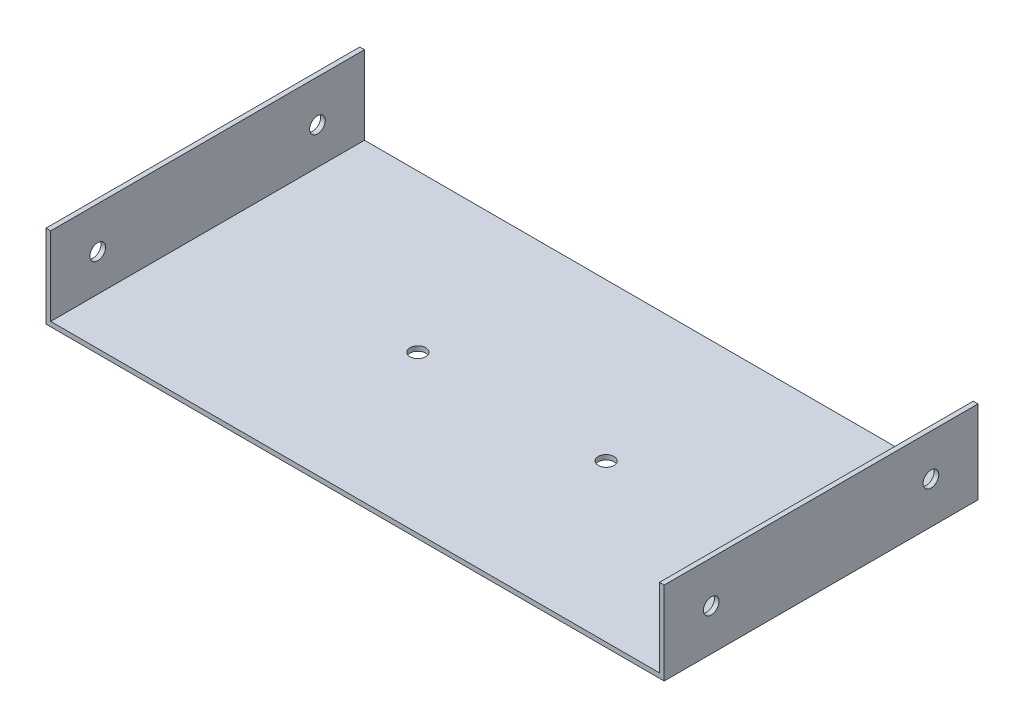
ISO-10303-21;
HEADER;
FILE_DESCRIPTION(('STEP AP214'),'2;1');
FILE_NAME('part.step','',(''),(''),'','','');
FILE_SCHEMA(('AUTOMOTIVE_DESIGN { 1 0 10303 214 1 1 1 1 }'));
ENDSEC;
DATA;
#1=APPLICATION_CONTEXT('core data for automotive mechanical design processes');
#2=APPLICATION_PROTOCOL_DEFINITION('international standard','automotive_design',2000,#1);
#3=PRODUCT_CONTEXT('',#1,'mechanical');
#4=PRODUCT('Part','Part','',(#3));
#5=PRODUCT_RELATED_PRODUCT_CATEGORY('part','',(#4));
#6=PRODUCT_DEFINITION_FORMATION('','',#4);
#7=PRODUCT_DEFINITION_CONTEXT('part definition',#1,'design');
#8=PRODUCT_DEFINITION('design','',#6,#7);
#9=PRODUCT_DEFINITION_SHAPE('','',#8);
#10=(LENGTH_UNIT() NAMED_UNIT(*) SI_UNIT(.MILLI.,.METRE.));
#11=(NAMED_UNIT(*) PLANE_ANGLE_UNIT() SI_UNIT($,.RADIAN.));
#12=(NAMED_UNIT(*) SI_UNIT($,.STERADIAN.) SOLID_ANGLE_UNIT());
#13=UNCERTAINTY_MEASURE_WITH_UNIT(LENGTH_MEASURE(1.E-05),#10,'distance_accuracy_value','');
#14=(GEOMETRIC_REPRESENTATION_CONTEXT(3) GLOBAL_UNCERTAINTY_ASSIGNED_CONTEXT((#13)) GLOBAL_UNIT_ASSIGNED_CONTEXT((#10,
#11,#12)) REPRESENTATION_CONTEXT('',''));
#15=CARTESIAN_POINT('',(0.,0.,0.));
#16=DIRECTION('',(0.,0.,1.));
#17=DIRECTION('',(1.,0.,0.));
#18=AXIS2_PLACEMENT_3D('',#15,#16,#17);
#19=CARTESIAN_POINT('',(197.,3.,-100.));
#20=DIRECTION('',(-1.,0.,0.));
#21=DIRECTION('',(0.,0.,1.));
#22=AXIS2_PLACEMENT_3D('',#19,#20,#21);
#23=PLANE('',#22);
#24=CARTESIAN_POINT('',(197.,26.5,-70.));
#25=DIRECTION('',(1.,0.,0.));
#26=DIRECTION('',(0.,0.,-1.));
#27=AXIS2_PLACEMENT_3D('',#24,#25,#26);
#28=CIRCLE('',#27,5.);
#29=CARTESIAN_POINT('',(197.,26.5,-75.));
#30=VERTEX_POINT('',#29);
#31=EDGE_CURVE('E173',#30,#30,#28,.T.);
#32=ORIENTED_EDGE('',*,*,#31,.F.);
#33=EDGE_LOOP('',(#32));
#34=FACE_BOUND('',#33,.T.);
#35=CARTESIAN_POINT('',(197.,26.5,70.));
#36=DIRECTION('',(1.,0.,0.));
#37=DIRECTION('',(0.,0.,-1.));
#38=AXIS2_PLACEMENT_3D('',#35,#36,#37);
#39=CIRCLE('',#38,4.99999999999999);
#40=CARTESIAN_POINT('',(197.,26.5,65.));
#41=VERTEX_POINT('',#40);
#42=EDGE_CURVE('E186',#41,#41,#39,.T.);
#43=ORIENTED_EDGE('',*,*,#42,.F.);
#44=EDGE_LOOP('',(#43));
#45=FACE_BOUND('',#44,.T.);
#46=DIRECTION('',(0.,0.,-1.));
#47=VECTOR('',#46,1.);
#48=CARTESIAN_POINT('',(197.,0.,-100.));
#49=LINE('',#48,#47);
#50=CARTESIAN_POINT('',(197.,0.,100.));
#51=VERTEX_POINT('',#50);
#52=CARTESIAN_POINT('',(197.,0.,-100.));
#53=VERTEX_POINT('',#52);
#54=EDGE_CURVE('E147',#51,#53,#49,.T.);
#55=ORIENTED_EDGE('',*,*,#54,.T.);
#56=DIRECTION('',(0.,-1.,0.));
#57=VECTOR('',#56,1.);
#58=CARTESIAN_POINT('',(197.,3.,-100.));
#59=LINE('',#58,#57);
#60=CARTESIAN_POINT('',(197.,53.,-100.));
#61=VERTEX_POINT('',#60);
#62=EDGE_CURVE('E11',#61,#53,#59,.T.);
#63=ORIENTED_EDGE('',*,*,#62,.F.);
#64=DIRECTION('',(0.,0.,-1.));
#65=VECTOR('',#64,1.);
#66=CARTESIAN_POINT('',(197.,53.,100.));
#67=LINE('',#66,#65);
#68=CARTESIAN_POINT('',(197.,53.,100.));
#69=VERTEX_POINT('',#68);
#70=EDGE_CURVE('E132',#69,#61,#67,.T.);
#71=ORIENTED_EDGE('',*,*,#70,.F.);
#72=DIRECTION('',(0.,-1.,0.));
#73=VECTOR('',#72,1.);
#74=CARTESIAN_POINT('',(197.,3.,100.));
#75=LINE('',#74,#73);
#76=EDGE_CURVE('E151',#69,#51,#75,.T.);
#77=ORIENTED_EDGE('',*,*,#76,.T.);
#78=EDGE_LOOP('',(#55,#63,#71,#77));
#79=FACE_BOUND('',#78,.T.);
#80=ADVANCED_FACE('F34',(#34,#45,#79),#23,.F.);
#81=CARTESIAN_POINT('',(-197.,3.,-100.));
#82=DIRECTION('',(0.,0.,1.));
#83=DIRECTION('',(1.,0.,0.));
#84=AXIS2_PLACEMENT_3D('',#81,#82,#83);
#85=PLANE('',#84);
#86=DIRECTION('',(-1.,0.,0.));
#87=VECTOR('',#86,1.);
#88=CARTESIAN_POINT('',(-197.,0.,-100.));
#89=LINE('',#88,#87);
#90=CARTESIAN_POINT('',(-197.,0.,-100.));
#91=VERTEX_POINT('',#90);
#92=EDGE_CURVE('E154',#53,#91,#89,.T.);
#93=ORIENTED_EDGE('',*,*,#92,.T.);
#94=DIRECTION('',(0.,-1.,0.));
#95=VECTOR('',#94,1.);
#96=CARTESIAN_POINT('',(-197.,3.,-100.));
#97=LINE('',#96,#95);
#98=CARTESIAN_POINT('',(-197.,53.,-100.));
#99=VERTEX_POINT('',#98);
#100=EDGE_CURVE('E42',#99,#91,#97,.T.);
#101=ORIENTED_EDGE('',*,*,#100,.F.);
#102=DIRECTION('',(1.,0.,0.));
#103=VECTOR('',#102,1.);
#104=CARTESIAN_POINT('',(-197.,53.,-100.));
#105=LINE('',#104,#103);
#106=CARTESIAN_POINT('',(-194.,53.,-100.));
#107=VERTEX_POINT('',#106);
#108=EDGE_CURVE('E122',#99,#107,#105,.T.);
#109=ORIENTED_EDGE('',*,*,#108,.T.);
#110=DIRECTION('',(0.,-1.,0.));
#111=VECTOR('',#110,1.);
#112=CARTESIAN_POINT('',(-194.,53.,-100.));
#113=LINE('',#112,#111);
#114=CARTESIAN_POINT('',(-194.,3.,-100.));
#115=VERTEX_POINT('',#114);
#116=EDGE_CURVE('E108',#107,#115,#113,.T.);
#117=ORIENTED_EDGE('',*,*,#116,.T.);
#118=DIRECTION('',(-1.,0.,0.));
#119=VECTOR('',#118,1.);
#120=CARTESIAN_POINT('',(-197.,3.,-100.));
#121=LINE('',#120,#119);
#122=CARTESIAN_POINT('',(194.,3.,-100.));
#123=VERTEX_POINT('',#122);
#124=EDGE_CURVE('E55',#123,#115,#121,.T.);
#125=ORIENTED_EDGE('',*,*,#124,.F.);
#126=DIRECTION('',(0.,-1.,0.));
#127=VECTOR('',#126,1.);
#128=CARTESIAN_POINT('',(194.,53.,-100.));
#129=LINE('',#128,#127);
#130=CARTESIAN_POINT('',(194.,53.,-100.));
#131=VERTEX_POINT('',#130);
#132=EDGE_CURVE('E144',#131,#123,#129,.T.);
#133=ORIENTED_EDGE('',*,*,#132,.F.);
#134=DIRECTION('',(-1.,0.,0.));
#135=VECTOR('',#134,1.);
#136=CARTESIAN_POINT('',(197.,53.,-100.));
#137=LINE('',#136,#135);
#138=EDGE_CURVE('E136',#61,#131,#137,.T.);
#139=ORIENTED_EDGE('',*,*,#138,.F.);
#140=ORIENTED_EDGE('',*,*,#62,.T.);
#141=EDGE_LOOP('',(#93,#101,#109,#117,#125,#133,#139,#140));
#142=FACE_BOUND('',#141,.T.);
#143=ADVANCED_FACE('F213',(#142),#85,.F.);
#144=CARTESIAN_POINT('',(-197.,3.,-100.));
#145=DIRECTION('',(1.,0.,0.));
#146=DIRECTION('',(0.,0.,-1.));
#147=AXIS2_PLACEMENT_3D('',#144,#145,#146);
#148=PLANE('',#147);
#149=CARTESIAN_POINT('',(-197.,26.5,-69.9999999999999));
#150=DIRECTION('',(1.,0.,0.));
#151=DIRECTION('',(0.,0.,-1.));
#152=AXIS2_PLACEMENT_3D('',#149,#150,#151);
#153=CIRCLE('',#152,5.);
#154=CARTESIAN_POINT('',(-197.,26.5,-74.9999999999999));
#155=VERTEX_POINT('',#154);
#156=EDGE_CURVE('E167',#155,#155,#153,.T.);
#157=ORIENTED_EDGE('',*,*,#156,.T.);
#158=EDGE_LOOP('',(#157));
#159=FACE_BOUND('',#158,.T.);
#160=CARTESIAN_POINT('',(-197.,26.5,70.0000000000001));
#161=DIRECTION('',(1.,0.,0.));
#162=DIRECTION('',(0.,0.,-1.));
#163=AXIS2_PLACEMENT_3D('',#160,#161,#162);
#164=CIRCLE('',#163,4.99999999999999);
#165=CARTESIAN_POINT('',(-197.,26.5,65.0000000000001));
#166=VERTEX_POINT('',#165);
#167=EDGE_CURVE('E178',#166,#166,#164,.T.);
#168=ORIENTED_EDGE('',*,*,#167,.T.);
#169=EDGE_LOOP('',(#168));
#170=FACE_BOUND('',#169,.T.);
#171=DIRECTION('',(0.,0.,1.));
#172=VECTOR('',#171,1.);
#173=CARTESIAN_POINT('',(-197.,0.,-100.));
#174=LINE('',#173,#172);
#175=CARTESIAN_POINT('',(-197.,0.,100.));
#176=VERTEX_POINT('',#175);
#177=EDGE_CURVE('E156',#91,#176,#174,.T.);
#178=ORIENTED_EDGE('',*,*,#177,.T.);
#179=DIRECTION('',(0.,-1.,0.));
#180=VECTOR('',#179,1.);
#181=CARTESIAN_POINT('',(-197.,3.,100.));
#182=LINE('',#181,#180);
#183=CARTESIAN_POINT('',(-197.,53.,100.));
#184=VERTEX_POINT('',#183);
#185=EDGE_CURVE('E161',#184,#176,#182,.T.);
#186=ORIENTED_EDGE('',*,*,#185,.F.);
#187=DIRECTION('',(0.,0.,-1.));
#188=VECTOR('',#187,1.);
#189=CARTESIAN_POINT('',(-197.,53.,100.));
#190=LINE('',#189,#188);
#191=EDGE_CURVE('E118',#184,#99,#190,.T.);
#192=ORIENTED_EDGE('',*,*,#191,.T.);
#193=ORIENTED_EDGE('',*,*,#100,.T.);
#194=EDGE_LOOP('',(#178,#186,#192,#193));
#195=FACE_BOUND('',#194,.T.);
#196=ADVANCED_FACE('F218',(#159,#170,#195),#148,.F.);
#197=CARTESIAN_POINT('',(-197.,3.,100.));
#198=DIRECTION('',(0.,0.,-1.));
#199=DIRECTION('',(-1.,0.,0.));
#200=AXIS2_PLACEMENT_3D('',#197,#198,#199);
#201=PLANE('',#200);
#202=DIRECTION('',(1.,0.,0.));
#203=VECTOR('',#202,1.);
#204=CARTESIAN_POINT('',(-197.,0.,100.));
#205=LINE('',#204,#203);
#206=EDGE_CURVE('E149',#176,#51,#205,.T.);
#207=ORIENTED_EDGE('',*,*,#206,.T.);
#208=ORIENTED_EDGE('',*,*,#76,.F.);
#209=DIRECTION('',(1.,0.,0.));
#210=VECTOR('',#209,1.);
#211=CARTESIAN_POINT('',(194.,53.,100.));
#212=LINE('',#211,#210);
#213=CARTESIAN_POINT('',(194.,53.,100.));
#214=VERTEX_POINT('',#213);
#215=EDGE_CURVE('E129',#214,#69,#212,.T.);
#216=ORIENTED_EDGE('',*,*,#215,.F.);
#217=DIRECTION('',(0.,-1.,0.));
#218=VECTOR('',#217,1.);
#219=CARTESIAN_POINT('',(194.,53.,100.));
#220=LINE('',#219,#218);
#221=CARTESIAN_POINT('',(194.,3.,100.));
#222=VERTEX_POINT('',#221);
#223=EDGE_CURVE('E140',#214,#222,#220,.T.);
#224=ORIENTED_EDGE('',*,*,#223,.T.);
#225=DIRECTION('',(1.,0.,0.));
#226=VECTOR('',#225,1.);
#227=CARTESIAN_POINT('',(-197.,3.,100.));
#228=LINE('',#227,#226);
#229=CARTESIAN_POINT('',(-194.,3.,100.));
#230=VERTEX_POINT('',#229);
#231=EDGE_CURVE('E105',#230,#222,#228,.T.);
#232=ORIENTED_EDGE('',*,*,#231,.F.);
#233=DIRECTION('',(0.,-1.,0.));
#234=VECTOR('',#233,1.);
#235=CARTESIAN_POINT('',(-194.,53.,100.));
#236=LINE('',#235,#234);
#237=CARTESIAN_POINT('',(-194.,53.,100.));
#238=VERTEX_POINT('',#237);
#239=EDGE_CURVE('E99',#238,#230,#236,.T.);
#240=ORIENTED_EDGE('',*,*,#239,.F.);
#241=DIRECTION('',(-1.,0.,0.));
#242=VECTOR('',#241,1.);
#243=CARTESIAN_POINT('',(-194.,53.,100.));
#244=LINE('',#243,#242);
#245=EDGE_CURVE('E103',#238,#184,#244,.T.);
#246=ORIENTED_EDGE('',*,*,#245,.T.);
#247=ORIENTED_EDGE('',*,*,#185,.T.);
#248=EDGE_LOOP('',(#207,#208,#216,#224,#232,#240,#246,#247));
#249=FACE_BOUND('',#248,.T.);
#250=ADVANCED_FACE('F101',(#249),#201,.F.);
#251=CARTESIAN_POINT('',(0.,3.,0.));
#252=DIRECTION('',(0.,1.,0.));
#253=DIRECTION('',(0.,0.,1.));
#254=AXIS2_PLACEMENT_3D('',#251,#252,#253);
#255=PLANE('',#254);
#256=CARTESIAN_POINT('',(60.,3.,0.));
#257=DIRECTION('',(0.,1.,0.));
#258=DIRECTION('',(0.,0.,1.));
#259=AXIS2_PLACEMENT_3D('',#256,#257,#258);
#260=CIRCLE('',#259,5.);
#261=CARTESIAN_POINT('',(60.,3.,5.));
#262=VERTEX_POINT('',#261);
#263=EDGE_CURVE('E181',#262,#262,#260,.T.);
#264=ORIENTED_EDGE('',*,*,#263,.F.);
#265=EDGE_LOOP('',(#264));
#266=FACE_BOUND('',#265,.T.);
#267=CARTESIAN_POINT('',(-60.,3.,0.));
#268=DIRECTION('',(0.,1.,0.));
#269=DIRECTION('',(0.,0.,1.));
#270=AXIS2_PLACEMENT_3D('',#267,#268,#269);
#271=CIRCLE('',#270,5.);
#272=CARTESIAN_POINT('',(-60.,3.,5.));
#273=VERTEX_POINT('',#272);
#274=EDGE_CURVE('E361',#273,#273,#271,.T.);
#275=ORIENTED_EDGE('',*,*,#274,.F.);
#276=EDGE_LOOP('',(#275));
#277=FACE_BOUND('',#276,.T.);
#278=DIRECTION('',(0.,0.,1.));
#279=VECTOR('',#278,1.);
#280=CARTESIAN_POINT('',(-194.,3.,-100.));
#281=LINE('',#280,#279);
#282=EDGE_CURVE('E50',#115,#230,#281,.T.);
#283=ORIENTED_EDGE('',*,*,#282,.T.);
#284=ORIENTED_EDGE('',*,*,#231,.T.);
#285=DIRECTION('',(0.,0.,1.));
#286=VECTOR('',#285,1.);
#287=CARTESIAN_POINT('',(194.,3.,-100.));
#288=LINE('',#287,#286);
#289=EDGE_CURVE('E133',#123,#222,#288,.T.);
#290=ORIENTED_EDGE('',*,*,#289,.F.);
#291=ORIENTED_EDGE('',*,*,#124,.T.);
#292=EDGE_LOOP('',(#283,#284,#290,#291));
#293=FACE_BOUND('',#292,.T.);
#294=ADVANCED_FACE('F237',(#266,#277,#293),#255,.T.);
#295=CARTESIAN_POINT('',(0.,0.,0.));
#296=DIRECTION('',(0.,1.,0.));
#297=DIRECTION('',(0.,0.,1.));
#298=AXIS2_PLACEMENT_3D('',#295,#296,#297);
#299=PLANE('',#298);
#300=CARTESIAN_POINT('',(60.,0.,0.));
#301=DIRECTION('',(0.,-1.,0.));
#302=DIRECTION('',(0.,0.,-1.));
#303=AXIS2_PLACEMENT_3D('',#300,#301,#302);
#304=CIRCLE('',#303,5.);
#305=CARTESIAN_POINT('',(60.,0.,-5.));
#306=VERTEX_POINT('',#305);
#307=EDGE_CURVE('E360',#306,#306,#304,.T.);
#308=ORIENTED_EDGE('',*,*,#307,.F.);
#309=EDGE_LOOP('',(#308));
#310=FACE_BOUND('',#309,.T.);
#311=CARTESIAN_POINT('',(-60.,0.,0.));
#312=DIRECTION('',(0.,-1.,0.));
#313=DIRECTION('',(0.,0.,-1.));
#314=AXIS2_PLACEMENT_3D('',#311,#312,#313);
#315=CIRCLE('',#314,5.);
#316=CARTESIAN_POINT('',(-60.,0.,-5.));
#317=VERTEX_POINT('',#316);
#318=EDGE_CURVE('E362',#317,#317,#315,.T.);
#319=ORIENTED_EDGE('',*,*,#318,.F.);
#320=EDGE_LOOP('',(#319));
#321=FACE_BOUND('',#320,.T.);
#322=ORIENTED_EDGE('',*,*,#54,.F.);
#323=ORIENTED_EDGE('',*,*,#206,.F.);
#324=ORIENTED_EDGE('',*,*,#177,.F.);
#325=ORIENTED_EDGE('',*,*,#92,.F.);
#326=EDGE_LOOP('',(#322,#323,#324,#325));
#327=FACE_BOUND('',#326,.T.);
#328=ADVANCED_FACE('F228',(#310,#321,#327),#299,.F.);
#329=CARTESIAN_POINT('',(194.,53.,-100.));
#330=DIRECTION('',(1.,0.,0.));
#331=DIRECTION('',(0.,0.,-1.));
#332=AXIS2_PLACEMENT_3D('',#329,#330,#331);
#333=PLANE('',#332);
#334=CARTESIAN_POINT('',(194.,26.5,-70.));
#335=DIRECTION('',(1.,0.,0.));
#336=DIRECTION('',(0.,0.,-1.));
#337=AXIS2_PLACEMENT_3D('',#334,#335,#336);
#338=CIRCLE('',#337,5.);
#339=CARTESIAN_POINT('',(194.,26.5,-75.));
#340=VERTEX_POINT('',#339);
#341=EDGE_CURVE('E109',#340,#340,#338,.T.);
#342=ORIENTED_EDGE('',*,*,#341,.T.);
#343=EDGE_LOOP('',(#342));
#344=FACE_BOUND('',#343,.T.);
#345=CARTESIAN_POINT('',(194.,26.5,70.));
#346=DIRECTION('',(1.,0.,0.));
#347=DIRECTION('',(0.,0.,-1.));
#348=AXIS2_PLACEMENT_3D('',#345,#346,#347);
#349=CIRCLE('',#348,4.99999999999999);
#350=CARTESIAN_POINT('',(194.,26.5,65.));
#351=VERTEX_POINT('',#350);
#352=EDGE_CURVE('E166',#351,#351,#349,.T.);
#353=ORIENTED_EDGE('',*,*,#352,.T.);
#354=EDGE_LOOP('',(#353));
#355=FACE_BOUND('',#354,.T.);
#356=ORIENTED_EDGE('',*,*,#289,.T.);
#357=ORIENTED_EDGE('',*,*,#223,.F.);
#358=DIRECTION('',(0.,0.,1.));
#359=VECTOR('',#358,1.);
#360=CARTESIAN_POINT('',(194.,53.,-100.));
#361=LINE('',#360,#359);
#362=EDGE_CURVE('E138',#131,#214,#361,.T.);
#363=ORIENTED_EDGE('',*,*,#362,.F.);
#364=ORIENTED_EDGE('',*,*,#132,.T.);
#365=EDGE_LOOP('',(#356,#357,#363,#364));
#366=FACE_BOUND('',#365,.T.);
#367=ADVANCED_FACE('F208',(#344,#355,#366),#333,.F.);
#368=CARTESIAN_POINT('',(0.,53.,0.));
#369=DIRECTION('',(0.,1.,0.));
#370=DIRECTION('',(0.,0.,1.));
#371=AXIS2_PLACEMENT_3D('',#368,#369,#370);
#372=PLANE('',#371);
#373=ORIENTED_EDGE('',*,*,#215,.T.);
#374=ORIENTED_EDGE('',*,*,#70,.T.);
#375=ORIENTED_EDGE('',*,*,#138,.T.);
#376=ORIENTED_EDGE('',*,*,#362,.T.);
#377=EDGE_LOOP('',(#373,#374,#375,#376));
#378=FACE_BOUND('',#377,.T.);
#379=ADVANCED_FACE('F200',(#378),#372,.T.);
#380=CARTESIAN_POINT('',(-194.,53.,-100.));
#381=DIRECTION('',(1.,0.,0.));
#382=DIRECTION('',(0.,0.,-1.));
#383=AXIS2_PLACEMENT_3D('',#380,#381,#382);
#384=PLANE('',#383);
#385=CARTESIAN_POINT('',(-194.,26.5,-69.9999999999999));
#386=DIRECTION('',(1.,0.,0.));
#387=DIRECTION('',(0.,0.,-1.));
#388=AXIS2_PLACEMENT_3D('',#385,#386,#387);
#389=CIRCLE('',#388,5.);
#390=CARTESIAN_POINT('',(-194.,26.5,-74.9999999999999));
#391=VERTEX_POINT('',#390);
#392=EDGE_CURVE('E37',#391,#391,#389,.T.);
#393=ORIENTED_EDGE('',*,*,#392,.F.);
#394=EDGE_LOOP('',(#393));
#395=FACE_BOUND('',#394,.T.);
#396=CARTESIAN_POINT('',(-194.,26.5,70.0000000000001));
#397=DIRECTION('',(1.,0.,0.));
#398=DIRECTION('',(0.,0.,-1.));
#399=AXIS2_PLACEMENT_3D('',#396,#397,#398);
#400=CIRCLE('',#399,4.99999999999999);
#401=CARTESIAN_POINT('',(-194.,26.5,65.0000000000001));
#402=VERTEX_POINT('',#401);
#403=EDGE_CURVE('E164',#402,#402,#400,.T.);
#404=ORIENTED_EDGE('',*,*,#403,.F.);
#405=EDGE_LOOP('',(#404));
#406=FACE_BOUND('',#405,.T.);
#407=ORIENTED_EDGE('',*,*,#282,.F.);
#408=ORIENTED_EDGE('',*,*,#116,.F.);
#409=DIRECTION('',(0.,0.,1.));
#410=VECTOR('',#409,1.);
#411=CARTESIAN_POINT('',(-194.,53.,-100.));
#412=LINE('',#411,#410);
#413=EDGE_CURVE('E116',#107,#238,#412,.T.);
#414=ORIENTED_EDGE('',*,*,#413,.T.);
#415=ORIENTED_EDGE('',*,*,#239,.T.);
#416=EDGE_LOOP('',(#407,#408,#414,#415));
#417=FACE_BOUND('',#416,.T.);
#418=ADVANCED_FACE('F120',(#395,#406,#417),#384,.T.);
#419=CARTESIAN_POINT('',(0.,53.,0.));
#420=DIRECTION('',(0.,-1.,0.));
#421=DIRECTION('',(0.,0.,-1.));
#422=AXIS2_PLACEMENT_3D('',#419,#420,#421);
#423=PLANE('',#422);
#424=ORIENTED_EDGE('',*,*,#245,.F.);
#425=ORIENTED_EDGE('',*,*,#413,.F.);
#426=ORIENTED_EDGE('',*,*,#108,.F.);
#427=ORIENTED_EDGE('',*,*,#191,.F.);
#428=EDGE_LOOP('',(#424,#425,#426,#427));
#429=FACE_BOUND('',#428,.T.);
#430=ADVANCED_FACE('F114',(#429),#423,.F.);
#431=CARTESIAN_POINT('',(-197.,26.5,70.0000000000001));
#432=DIRECTION('',(1.,0.,0.));
#433=DIRECTION('',(0.,0.,-1.));
#434=AXIS2_PLACEMENT_3D('',#431,#432,#433);
#435=CYLINDRICAL_SURFACE('',#434,4.99999999999999);
#436=ORIENTED_EDGE('',*,*,#403,.T.);
#437=EDGE_LOOP('',(#436));
#438=FACE_BOUND('',#437,.T.);
#439=ORIENTED_EDGE('',*,*,#167,.F.);
#440=EDGE_LOOP('',(#439));
#441=FACE_BOUND('',#440,.T.);
#442=ADVANCED_FACE('F206',(#438,#441),#435,.F.);
#443=CARTESIAN_POINT('',(-197.,26.5,-69.9999999999999));
#444=DIRECTION('',(1.,0.,0.));
#445=DIRECTION('',(0.,0.,-1.));
#446=AXIS2_PLACEMENT_3D('',#443,#444,#445);
#447=CYLINDRICAL_SURFACE('',#446,5.);
#448=ORIENTED_EDGE('',*,*,#392,.T.);
#449=EDGE_LOOP('',(#448));
#450=FACE_BOUND('',#449,.T.);
#451=ORIENTED_EDGE('',*,*,#156,.F.);
#452=EDGE_LOOP('',(#451));
#453=FACE_BOUND('',#452,.T.);
#454=ADVANCED_FACE('F195',(#450,#453),#447,.F.);
#455=ORIENTED_EDGE('',*,*,#42,.T.);
#456=EDGE_LOOP('',(#455));
#457=FACE_BOUND('',#456,.T.);
#458=ORIENTED_EDGE('',*,*,#352,.F.);
#459=EDGE_LOOP('',(#458));
#460=FACE_BOUND('',#459,.T.);
#461=ADVANCED_FACE('F259',(#457,#460),#435,.F.);
#462=ORIENTED_EDGE('',*,*,#31,.T.);
#463=EDGE_LOOP('',(#462));
#464=FACE_BOUND('',#463,.T.);
#465=ORIENTED_EDGE('',*,*,#341,.F.);
#466=EDGE_LOOP('',(#465));
#467=FACE_BOUND('',#466,.T.);
#468=ADVANCED_FACE('F264',(#464,#467),#447,.F.);
#469=CARTESIAN_POINT('',(-60.,53.,0.));
#470=DIRECTION('',(0.,-1.,0.));
#471=DIRECTION('',(0.,0.,-1.));
#472=AXIS2_PLACEMENT_3D('',#469,#470,#471);
#473=CYLINDRICAL_SURFACE('',#472,5.);
#474=ORIENTED_EDGE('',*,*,#274,.T.);
#475=EDGE_LOOP('',(#474));
#476=FACE_BOUND('',#475,.T.);
#477=ORIENTED_EDGE('',*,*,#318,.T.);
#478=EDGE_LOOP('',(#477));
#479=FACE_BOUND('',#478,.T.);
#480=ADVANCED_FACE('F270',(#476,#479),#473,.F.);
#481=CARTESIAN_POINT('',(60.,53.,0.));
#482=DIRECTION('',(0.,-1.,0.));
#483=DIRECTION('',(0.,0.,-1.));
#484=AXIS2_PLACEMENT_3D('',#481,#482,#483);
#485=CYLINDRICAL_SURFACE('',#484,5.);
#486=ORIENTED_EDGE('',*,*,#263,.T.);
#487=EDGE_LOOP('',(#486));
#488=FACE_BOUND('',#487,.T.);
#489=ORIENTED_EDGE('',*,*,#307,.T.);
#490=EDGE_LOOP('',(#489));
#491=FACE_BOUND('',#490,.T.);
#492=ADVANCED_FACE('F341',(#488,#491),#485,.F.);
#493=CLOSED_SHELL('',(#80,#143,#196,#250,#294,#328,#367,#379,#418,#430,#442,#454,#461,#468,#480,#492));
#494=MANIFOLD_SOLID_BREP('B2',#493);
#495=ADVANCED_BREP_SHAPE_REPRESENTATION('',(#18,#494),#14);
#496=SHAPE_DEFINITION_REPRESENTATION(#9,#495);
ENDSEC;
END-ISO-10303-21;
